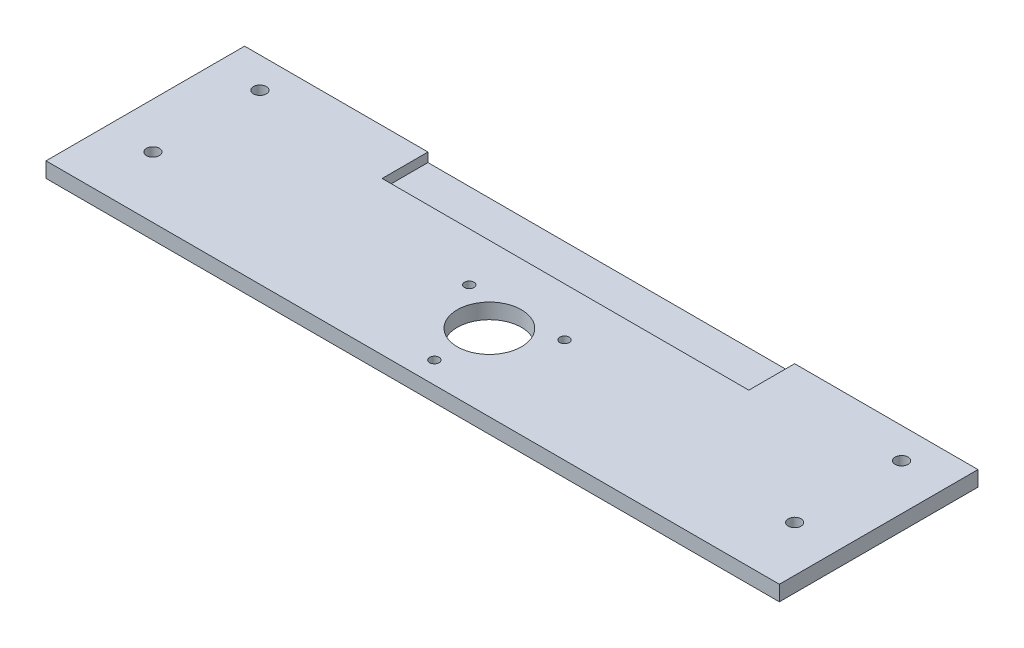
ISO-10303-21;
HEADER;
FILE_DESCRIPTION(('STEP AP214'),'2;1');
FILE_NAME('part.step','',(''),(''),'','','');
FILE_SCHEMA(('AUTOMOTIVE_DESIGN { 1 0 10303 214 1 1 1 1 }'));
ENDSEC;
DATA;
#1=APPLICATION_CONTEXT('core data for automotive mechanical design processes');
#2=APPLICATION_PROTOCOL_DEFINITION('international standard','automotive_design',2000,#1);
#3=PRODUCT_CONTEXT('',#1,'mechanical');
#4=PRODUCT('Part','Part','',(#3));
#5=PRODUCT_RELATED_PRODUCT_CATEGORY('part','',(#4));
#6=PRODUCT_DEFINITION_FORMATION('','',#4);
#7=PRODUCT_DEFINITION_CONTEXT('part definition',#1,'design');
#8=PRODUCT_DEFINITION('design','',#6,#7);
#9=PRODUCT_DEFINITION_SHAPE('','',#8);
#10=(LENGTH_UNIT() NAMED_UNIT(*) SI_UNIT(.MILLI.,.METRE.));
#11=(NAMED_UNIT(*) PLANE_ANGLE_UNIT() SI_UNIT($,.RADIAN.));
#12=(NAMED_UNIT(*) SI_UNIT($,.STERADIAN.) SOLID_ANGLE_UNIT());
#13=UNCERTAINTY_MEASURE_WITH_UNIT(LENGTH_MEASURE(1.E-05),#10,'distance_accuracy_value','');
#14=(GEOMETRIC_REPRESENTATION_CONTEXT(3) GLOBAL_UNCERTAINTY_ASSIGNED_CONTEXT((#13)) GLOBAL_UNIT_ASSIGNED_CONTEXT((#10,
#11,#12)) REPRESENTATION_CONTEXT('',''));
#15=CARTESIAN_POINT('',(0.,0.,0.));
#16=DIRECTION('',(0.,0.,1.));
#17=DIRECTION('',(1.,0.,0.));
#18=AXIS2_PLACEMENT_3D('',#15,#16,#17);
#19=CARTESIAN_POINT('',(0.,5.,7.49999999999996));
#20=DIRECTION('',(0.,0.,-1.));
#21=DIRECTION('',(-1.,0.,0.));
#22=AXIS2_PLACEMENT_3D('',#19,#20,#21);
#23=PLANE('',#22);
#24=DIRECTION('',(1.,0.,0.));
#25=VECTOR('',#24,1.);
#26=CARTESIAN_POINT('',(0.,0.,7.49999999999996));
#27=LINE('',#26,#25);
#28=CARTESIAN_POINT('',(-120.,0.,7.49999999999998));
#29=VERTEX_POINT('',#28);
#30=CARTESIAN_POINT('',(120.,0.,7.49999999999995));
#31=VERTEX_POINT('',#30);
#32=EDGE_CURVE('E168',#29,#31,#27,.T.);
#33=ORIENTED_EDGE('',*,*,#32,.T.);
#34=DIRECTION('',(0.,-1.,0.));
#35=VECTOR('',#34,1.);
#36=CARTESIAN_POINT('',(120.,5.,7.49999999999995));
#37=LINE('',#36,#35);
#38=CARTESIAN_POINT('',(120.,5.,7.49999999999995));
#39=VERTEX_POINT('',#38);
#40=EDGE_CURVE('E11',#39,#31,#37,.T.);
#41=ORIENTED_EDGE('',*,*,#40,.F.);
#42=DIRECTION('',(1.,0.,0.));
#43=VECTOR('',#42,1.);
#44=CARTESIAN_POINT('',(0.,5.,7.49999999999996));
#45=LINE('',#44,#43);
#46=CARTESIAN_POINT('',(-120.,5.,7.49999999999998));
#47=VERTEX_POINT('',#46);
#48=EDGE_CURVE('E148',#47,#39,#45,.T.);
#49=ORIENTED_EDGE('',*,*,#48,.F.);
#50=DIRECTION('',(0.,-1.,0.));
#51=VECTOR('',#50,1.);
#52=CARTESIAN_POINT('',(-120.,5.,7.49999999999998));
#53=LINE('',#52,#51);
#54=EDGE_CURVE('E60',#47,#29,#53,.T.);
#55=ORIENTED_EDGE('',*,*,#54,.T.);
#56=EDGE_LOOP('',(#33,#41,#49,#55));
#57=FACE_BOUND('',#56,.T.);
#58=ADVANCED_FACE('F34',(#57),#23,.F.);
#59=CARTESIAN_POINT('',(120.,5.,0.));
#60=DIRECTION('',(-1.,0.,0.));
#61=DIRECTION('',(0.,0.,1.));
#62=AXIS2_PLACEMENT_3D('',#59,#60,#61);
#63=PLANE('',#62);
#64=DIRECTION('',(0.,0.,-1.));
#65=VECTOR('',#64,1.);
#66=CARTESIAN_POINT('',(120.,0.,0.));
#67=LINE('',#66,#65);
#68=CARTESIAN_POINT('',(120.,0.,-57.4999999999999));
#69=VERTEX_POINT('',#68);
#70=EDGE_CURVE('E170',#31,#69,#67,.T.);
#71=ORIENTED_EDGE('',*,*,#70,.T.);
#72=DIRECTION('',(0.,-1.,0.));
#73=VECTOR('',#72,1.);
#74=CARTESIAN_POINT('',(120.,5.,-57.4999999999999));
#75=LINE('',#74,#73);
#76=CARTESIAN_POINT('',(120.,5.,-57.4999999999999));
#77=VERTEX_POINT('',#76);
#78=EDGE_CURVE('E43',#77,#69,#75,.T.);
#79=ORIENTED_EDGE('',*,*,#78,.F.);
#80=DIRECTION('',(0.,0.,-1.));
#81=VECTOR('',#80,1.);
#82=CARTESIAN_POINT('',(120.,5.,0.));
#83=LINE('',#82,#81);
#84=EDGE_CURVE('E86',#39,#77,#83,.T.);
#85=ORIENTED_EDGE('',*,*,#84,.F.);
#86=ORIENTED_EDGE('',*,*,#40,.T.);
#87=EDGE_LOOP('',(#71,#79,#85,#86));
#88=FACE_BOUND('',#87,.T.);
#89=ADVANCED_FACE('F217',(#88),#63,.F.);
#90=CARTESIAN_POINT('',(0.,5.,-57.5));
#91=DIRECTION('',(0.,0.,-1.));
#92=DIRECTION('',(-1.,0.,0.));
#93=AXIS2_PLACEMENT_3D('',#90,#91,#92);
#94=PLANE('',#93);
#95=DIRECTION('',(0.,1.,0.));
#96=VECTOR('',#95,1.);
#97=CARTESIAN_POINT('',(60.,2.,-57.5));
#98=LINE('',#97,#96);
#99=CARTESIAN_POINT('',(60.,2.,-57.5));
#100=VERTEX_POINT('',#99);
#101=CARTESIAN_POINT('',(60.,5.,-57.5));
#102=VERTEX_POINT('',#101);
#103=EDGE_CURVE('E162',#100,#102,#98,.T.);
#104=ORIENTED_EDGE('',*,*,#103,.T.);
#105=DIRECTION('',(1.,0.,0.));
#106=VECTOR('',#105,1.);
#107=CARTESIAN_POINT('',(0.,5.,-57.5));
#108=LINE('',#107,#106);
#109=EDGE_CURVE('E151',#102,#77,#108,.T.);
#110=ORIENTED_EDGE('',*,*,#109,.T.);
#111=ORIENTED_EDGE('',*,*,#78,.T.);
#112=DIRECTION('',(1.,0.,0.));
#113=VECTOR('',#112,1.);
#114=CARTESIAN_POINT('',(0.,0.,-57.5));
#115=LINE('',#114,#113);
#116=CARTESIAN_POINT('',(-120.,0.,-57.5));
#117=VERTEX_POINT('',#116);
#118=EDGE_CURVE('E173',#117,#69,#115,.T.);
#119=ORIENTED_EDGE('',*,*,#118,.F.);
#120=DIRECTION('',(0.,-1.,0.));
#121=VECTOR('',#120,1.);
#122=CARTESIAN_POINT('',(-120.,5.,-57.5));
#123=LINE('',#122,#121);
#124=CARTESIAN_POINT('',(-120.,5.,-57.5));
#125=VERTEX_POINT('',#124);
#126=EDGE_CURVE('E182',#125,#117,#123,.T.);
#127=ORIENTED_EDGE('',*,*,#126,.F.);
#128=CARTESIAN_POINT('',(-60.,5.,-57.5));
#129=VERTEX_POINT('',#128);
#130=EDGE_CURVE('E131',#125,#129,#108,.T.);
#131=ORIENTED_EDGE('',*,*,#130,.T.);
#132=DIRECTION('',(0.,1.,0.));
#133=VECTOR('',#132,1.);
#134=CARTESIAN_POINT('',(-60.,2.,-57.5));
#135=LINE('',#134,#133);
#136=CARTESIAN_POINT('',(-60.,2.,-57.5));
#137=VERTEX_POINT('',#136);
#138=EDGE_CURVE('E51',#137,#129,#135,.T.);
#139=ORIENTED_EDGE('',*,*,#138,.F.);
#140=DIRECTION('',(-1.,0.,0.));
#141=VECTOR('',#140,1.);
#142=CARTESIAN_POINT('',(-60.,2.,-57.5));
#143=LINE('',#142,#141);
#144=EDGE_CURVE('E117',#100,#137,#143,.T.);
#145=ORIENTED_EDGE('',*,*,#144,.F.);
#146=EDGE_LOOP('',(#104,#110,#111,#119,#127,#131,#139,#145));
#147=FACE_BOUND('',#146,.T.);
#148=ADVANCED_FACE('F129',(#147),#94,.T.);
#149=CARTESIAN_POINT('',(-120.,5.,0.));
#150=DIRECTION('',(-1.,0.,0.));
#151=DIRECTION('',(0.,0.,1.));
#152=AXIS2_PLACEMENT_3D('',#149,#150,#151);
#153=PLANE('',#152);
#154=DIRECTION('',(0.,0.,-1.));
#155=VECTOR('',#154,1.);
#156=CARTESIAN_POINT('',(-120.,0.,0.));
#157=LINE('',#156,#155);
#158=EDGE_CURVE('E176',#29,#117,#157,.T.);
#159=ORIENTED_EDGE('',*,*,#158,.F.);
#160=ORIENTED_EDGE('',*,*,#54,.F.);
#161=DIRECTION('',(0.,0.,-1.));
#162=VECTOR('',#161,1.);
#163=CARTESIAN_POINT('',(-120.,5.,0.));
#164=LINE('',#163,#162);
#165=EDGE_CURVE('E153',#47,#125,#164,.T.);
#166=ORIENTED_EDGE('',*,*,#165,.T.);
#167=ORIENTED_EDGE('',*,*,#126,.T.);
#168=EDGE_LOOP('',(#159,#160,#166,#167));
#169=FACE_BOUND('',#168,.T.);
#170=ADVANCED_FACE('F222',(#169),#153,.T.);
#171=CARTESIAN_POINT('',(-105.,5.,-47.5));
#172=DIRECTION('',(0.,-1.,0.));
#173=DIRECTION('',(0.,0.,-1.));
#174=AXIS2_PLACEMENT_3D('',#171,#172,#173);
#175=CYLINDRICAL_SURFACE('',#174,2.1);
#176=CARTESIAN_POINT('',(-105.,5.,-47.5));
#177=DIRECTION('',(0.,1.,0.));
#178=DIRECTION('',(0.,0.,1.));
#179=AXIS2_PLACEMENT_3D('',#176,#177,#178);
#180=CIRCLE('',#179,2.1);
#181=CARTESIAN_POINT('',(-105.,5.,-45.4));
#182=VERTEX_POINT('',#181);
#183=EDGE_CURVE('E145',#182,#182,#180,.T.);
#184=ORIENTED_EDGE('',*,*,#183,.T.);
#185=EDGE_LOOP('',(#184));
#186=FACE_BOUND('',#185,.T.);
#187=CARTESIAN_POINT('',(-105.,0.,-47.5));
#188=DIRECTION('',(0.,1.,0.));
#189=DIRECTION('',(0.,0.,1.));
#190=AXIS2_PLACEMENT_3D('',#187,#188,#189);
#191=CIRCLE('',#190,2.1);
#192=CARTESIAN_POINT('',(-105.,0.,-45.4));
#193=VERTEX_POINT('',#192);
#194=EDGE_CURVE('E165',#193,#193,#191,.T.);
#195=ORIENTED_EDGE('',*,*,#194,.F.);
#196=EDGE_LOOP('',(#195));
#197=FACE_BOUND('',#196,.T.);
#198=ADVANCED_FACE('F232',(#186,#197),#175,.F.);
#199=CARTESIAN_POINT('',(-105.,5.,-12.5));
#200=DIRECTION('',(0.,-1.,0.));
#201=DIRECTION('',(0.,0.,-1.));
#202=AXIS2_PLACEMENT_3D('',#199,#200,#201);
#203=CYLINDRICAL_SURFACE('',#202,2.1);
#204=CARTESIAN_POINT('',(-105.,5.,-12.5));
#205=DIRECTION('',(0.,1.,0.));
#206=DIRECTION('',(0.,0.,1.));
#207=AXIS2_PLACEMENT_3D('',#204,#205,#206);
#208=CIRCLE('',#207,2.1);
#209=CARTESIAN_POINT('',(-105.,5.,-10.4));
#210=VERTEX_POINT('',#209);
#211=EDGE_CURVE('E141',#210,#210,#208,.T.);
#212=ORIENTED_EDGE('',*,*,#211,.T.);
#213=EDGE_LOOP('',(#212));
#214=FACE_BOUND('',#213,.T.);
#215=CARTESIAN_POINT('',(-105.,0.,-12.5));
#216=DIRECTION('',(0.,1.,0.));
#217=DIRECTION('',(0.,0.,1.));
#218=AXIS2_PLACEMENT_3D('',#215,#216,#217);
#219=CIRCLE('',#218,2.1);
#220=CARTESIAN_POINT('',(-105.,0.,-10.4));
#221=VERTEX_POINT('',#220);
#222=EDGE_CURVE('E161',#221,#221,#219,.T.);
#223=ORIENTED_EDGE('',*,*,#222,.F.);
#224=EDGE_LOOP('',(#223));
#225=FACE_BOUND('',#224,.T.);
#226=ADVANCED_FACE('F234',(#214,#225),#203,.F.);
#227=CARTESIAN_POINT('',(105.,5.,-12.5));
#228=DIRECTION('',(0.,-1.,0.));
#229=DIRECTION('',(0.,0.,-1.));
#230=AXIS2_PLACEMENT_3D('',#227,#228,#229);
#231=CYLINDRICAL_SURFACE('',#230,2.1);
#232=CARTESIAN_POINT('',(105.,5.,-12.5));
#233=DIRECTION('',(0.,1.,0.));
#234=DIRECTION('',(0.,0.,1.));
#235=AXIS2_PLACEMENT_3D('',#232,#233,#234);
#236=CIRCLE('',#235,2.1);
#237=CARTESIAN_POINT('',(105.,5.,-10.4));
#238=VERTEX_POINT('',#237);
#239=EDGE_CURVE('E138',#238,#238,#236,.F.);
#240=ORIENTED_EDGE('',*,*,#239,.F.);
#241=EDGE_LOOP('',(#240));
#242=FACE_BOUND('',#241,.T.);
#243=CARTESIAN_POINT('',(105.,0.,-12.5));
#244=DIRECTION('',(0.,1.,0.));
#245=DIRECTION('',(0.,0.,1.));
#246=AXIS2_PLACEMENT_3D('',#243,#244,#245);
#247=CIRCLE('',#246,2.1);
#248=CARTESIAN_POINT('',(105.,0.,-10.4));
#249=VERTEX_POINT('',#248);
#250=EDGE_CURVE('E158',#249,#249,#247,.F.);
#251=ORIENTED_EDGE('',*,*,#250,.T.);
#252=EDGE_LOOP('',(#251));
#253=FACE_BOUND('',#252,.T.);
#254=ADVANCED_FACE('F36',(#242,#253),#231,.F.);
#255=CARTESIAN_POINT('',(105.,5.,-47.5));
#256=DIRECTION('',(0.,-1.,0.));
#257=DIRECTION('',(0.,0.,-1.));
#258=AXIS2_PLACEMENT_3D('',#255,#256,#257);
#259=CYLINDRICAL_SURFACE('',#258,2.1);
#260=CARTESIAN_POINT('',(105.,5.,-47.5));
#261=DIRECTION('',(0.,1.,0.));
#262=DIRECTION('',(0.,0.,1.));
#263=AXIS2_PLACEMENT_3D('',#260,#261,#262);
#264=CIRCLE('',#263,2.1);
#265=CARTESIAN_POINT('',(105.,5.,-45.4));
#266=VERTEX_POINT('',#265);
#267=EDGE_CURVE('E155',#266,#266,#264,.F.);
#268=ORIENTED_EDGE('',*,*,#267,.F.);
#269=EDGE_LOOP('',(#268));
#270=FACE_BOUND('',#269,.T.);
#271=CARTESIAN_POINT('',(105.,0.,-47.5));
#272=DIRECTION('',(0.,1.,0.));
#273=DIRECTION('',(0.,0.,1.));
#274=AXIS2_PLACEMENT_3D('',#271,#272,#273);
#275=CIRCLE('',#274,2.1);
#276=CARTESIAN_POINT('',(105.,0.,-45.4));
#277=VERTEX_POINT('',#276);
#278=EDGE_CURVE('E142',#277,#277,#275,.F.);
#279=ORIENTED_EDGE('',*,*,#278,.T.);
#280=EDGE_LOOP('',(#279));
#281=FACE_BOUND('',#280,.T.);
#282=ADVANCED_FACE('F241',(#270,#281),#259,.F.);
#283=CARTESIAN_POINT('',(0.,5.,0.));
#284=DIRECTION('',(0.,1.,0.));
#285=DIRECTION('',(0.,0.,1.));
#286=AXIS2_PLACEMENT_3D('',#283,#284,#285);
#287=PLANE('',#286);
#288=CARTESIAN_POINT('',(-15.5884572681197,5.,-26.5934062357272));
#289=DIRECTION('',(0.,1.,0.));
#290=DIRECTION('',(0.,0.,1.));
#291=AXIS2_PLACEMENT_3D('',#288,#289,#290);
#292=CIRCLE('',#291,1.55);
#293=CARTESIAN_POINT('',(-15.5884572681197,5.,-25.0434062357272));
#294=VERTEX_POINT('',#293);
#295=EDGE_CURVE('E395',#294,#294,#292,.T.);
#296=ORIENTED_EDGE('',*,*,#295,.F.);
#297=EDGE_LOOP('',(#296));
#298=FACE_BOUND('',#297,.T.);
#299=CARTESIAN_POINT('',(0.,5.,0.406593764272944));
#300=DIRECTION('',(0.,1.,0.));
#301=DIRECTION('',(0.,0.,1.));
#302=AXIS2_PLACEMENT_3D('',#299,#300,#301);
#303=CIRCLE('',#302,1.55);
#304=CARTESIAN_POINT('',(0.,5.,1.95659376427294));
#305=VERTEX_POINT('',#304);
#306=EDGE_CURVE('E396',#305,#305,#303,.T.);
#307=ORIENTED_EDGE('',*,*,#306,.F.);
#308=EDGE_LOOP('',(#307));
#309=FACE_BOUND('',#308,.T.);
#310=CARTESIAN_POINT('',(15.5884572681201,5.,-26.5934062357268));
#311=DIRECTION('',(0.,1.,0.));
#312=DIRECTION('',(0.,0.,1.));
#313=AXIS2_PLACEMENT_3D('',#310,#311,#312);
#314=CIRCLE('',#313,1.55);
#315=CARTESIAN_POINT('',(15.5884572681201,5.,-25.0434062357268));
#316=VERTEX_POINT('',#315);
#317=EDGE_CURVE('E399',#316,#316,#314,.T.);
#318=ORIENTED_EDGE('',*,*,#317,.F.);
#319=EDGE_LOOP('',(#318));
#320=FACE_BOUND('',#319,.T.);
#321=CARTESIAN_POINT('',(0.,5.,-17.5934062357271));
#322=DIRECTION('',(0.,1.,0.));
#323=DIRECTION('',(0.,0.,1.));
#324=AXIS2_PLACEMENT_3D('',#321,#322,#323);
#325=CIRCLE('',#324,10.5);
#326=CARTESIAN_POINT('',(0.,5.,-7.09340623572705));
#327=VERTEX_POINT('',#326);
#328=EDGE_CURVE('E189',#327,#327,#325,.T.);
#329=ORIENTED_EDGE('',*,*,#328,.F.);
#330=EDGE_LOOP('',(#329));
#331=FACE_BOUND('',#330,.T.);
#332=DIRECTION('',(0.,0.,-1.));
#333=VECTOR('',#332,1.);
#334=CARTESIAN_POINT('',(60.,5.,-57.5));
#335=LINE('',#334,#333);
#336=CARTESIAN_POINT('',(60.,5.,-42.5));
#337=VERTEX_POINT('',#336);
#338=EDGE_CURVE('E126',#337,#102,#335,.T.);
#339=ORIENTED_EDGE('',*,*,#338,.F.);
#340=DIRECTION('',(1.,0.,0.));
#341=VECTOR('',#340,1.);
#342=CARTESIAN_POINT('',(-60.,5.,-42.5));
#343=LINE('',#342,#341);
#344=CARTESIAN_POINT('',(-60.,5.,-42.5));
#345=VERTEX_POINT('',#344);
#346=EDGE_CURVE('E199',#345,#337,#343,.T.);
#347=ORIENTED_EDGE('',*,*,#346,.F.);
#348=DIRECTION('',(0.,0.,1.));
#349=VECTOR('',#348,1.);
#350=CARTESIAN_POINT('',(-60.,5.,-57.5));
#351=LINE('',#350,#349);
#352=EDGE_CURVE('E196',#129,#345,#351,.T.);
#353=ORIENTED_EDGE('',*,*,#352,.F.);
#354=ORIENTED_EDGE('',*,*,#130,.F.);
#355=ORIENTED_EDGE('',*,*,#165,.F.);
#356=ORIENTED_EDGE('',*,*,#48,.T.);
#357=ORIENTED_EDGE('',*,*,#84,.T.);
#358=ORIENTED_EDGE('',*,*,#109,.F.);
#359=EDGE_LOOP('',(#339,#347,#353,#354,#355,#356,#357,#358));
#360=FACE_BOUND('',#359,.T.);
#361=ORIENTED_EDGE('',*,*,#239,.T.);
#362=EDGE_LOOP('',(#361));
#363=FACE_BOUND('',#362,.T.);
#364=ORIENTED_EDGE('',*,*,#211,.F.);
#365=EDGE_LOOP('',(#364));
#366=FACE_BOUND('',#365,.T.);
#367=ORIENTED_EDGE('',*,*,#183,.F.);
#368=EDGE_LOOP('',(#367));
#369=FACE_BOUND('',#368,.T.);
#370=ORIENTED_EDGE('',*,*,#267,.T.);
#371=EDGE_LOOP('',(#370));
#372=FACE_BOUND('',#371,.T.);
#373=ADVANCED_FACE('F214',(#298,#309,#320,#331,#360,#363,#366,#369,#372),#287,.T.);
#374=CARTESIAN_POINT('',(0.,0.,0.));
#375=DIRECTION('',(0.,1.,0.));
#376=DIRECTION('',(0.,0.,1.));
#377=AXIS2_PLACEMENT_3D('',#374,#375,#376);
#378=PLANE('',#377);
#379=CARTESIAN_POINT('',(-15.5884572681197,0.,-26.5934062357272));
#380=DIRECTION('',(0.,1.,0.));
#381=DIRECTION('',(0.,0.,1.));
#382=AXIS2_PLACEMENT_3D('',#379,#380,#381);
#383=CIRCLE('',#382,1.55);
#384=CARTESIAN_POINT('',(-15.5884572681197,0.,-25.0434062357272));
#385=VERTEX_POINT('',#384);
#386=EDGE_CURVE('E38',#385,#385,#383,.T.);
#387=ORIENTED_EDGE('',*,*,#386,.T.);
#388=EDGE_LOOP('',(#387));
#389=FACE_BOUND('',#388,.T.);
#390=CARTESIAN_POINT('',(0.,0.,0.406593764272944));
#391=DIRECTION('',(0.,1.,0.));
#392=DIRECTION('',(0.,0.,1.));
#393=AXIS2_PLACEMENT_3D('',#390,#391,#392);
#394=CIRCLE('',#393,1.55);
#395=CARTESIAN_POINT('',(0.,0.,1.95659376427294));
#396=VERTEX_POINT('',#395);
#397=EDGE_CURVE('E191',#396,#396,#394,.T.);
#398=ORIENTED_EDGE('',*,*,#397,.T.);
#399=EDGE_LOOP('',(#398));
#400=FACE_BOUND('',#399,.T.);
#401=CARTESIAN_POINT('',(15.5884572681201,0.,-26.5934062357268));
#402=DIRECTION('',(0.,1.,0.));
#403=DIRECTION('',(0.,0.,1.));
#404=AXIS2_PLACEMENT_3D('',#401,#402,#403);
#405=CIRCLE('',#404,1.55);
#406=CARTESIAN_POINT('',(15.5884572681201,0.,-25.0434062357268));
#407=VERTEX_POINT('',#406);
#408=EDGE_CURVE('E188',#407,#407,#405,.T.);
#409=ORIENTED_EDGE('',*,*,#408,.T.);
#410=EDGE_LOOP('',(#409));
#411=FACE_BOUND('',#410,.T.);
#412=CARTESIAN_POINT('',(0.,0.,-17.5934062357271));
#413=DIRECTION('',(0.,1.,0.));
#414=DIRECTION('',(0.,0.,1.));
#415=AXIS2_PLACEMENT_3D('',#412,#413,#414);
#416=CIRCLE('',#415,10.5);
#417=CARTESIAN_POINT('',(0.,0.,-7.09340623572705));
#418=VERTEX_POINT('',#417);
#419=EDGE_CURVE('E185',#418,#418,#416,.T.);
#420=ORIENTED_EDGE('',*,*,#419,.T.);
#421=EDGE_LOOP('',(#420));
#422=FACE_BOUND('',#421,.T.);
#423=ORIENTED_EDGE('',*,*,#250,.F.);
#424=EDGE_LOOP('',(#423));
#425=FACE_BOUND('',#424,.T.);
#426=ORIENTED_EDGE('',*,*,#222,.T.);
#427=EDGE_LOOP('',(#426));
#428=FACE_BOUND('',#427,.T.);
#429=ORIENTED_EDGE('',*,*,#194,.T.);
#430=EDGE_LOOP('',(#429));
#431=FACE_BOUND('',#430,.T.);
#432=ORIENTED_EDGE('',*,*,#32,.F.);
#433=ORIENTED_EDGE('',*,*,#158,.T.);
#434=ORIENTED_EDGE('',*,*,#118,.T.);
#435=ORIENTED_EDGE('',*,*,#70,.F.);
#436=EDGE_LOOP('',(#432,#433,#434,#435));
#437=FACE_BOUND('',#436,.T.);
#438=ORIENTED_EDGE('',*,*,#278,.F.);
#439=EDGE_LOOP('',(#438));
#440=FACE_BOUND('',#439,.T.);
#441=ADVANCED_FACE('F220',(#389,#400,#411,#422,#425,#428,#431,#437,#440),#378,.F.);
#442=CARTESIAN_POINT('',(60.,2.,-57.5));
#443=DIRECTION('',(1.,0.,0.));
#444=DIRECTION('',(0.,0.,-1.));
#445=AXIS2_PLACEMENT_3D('',#442,#443,#444);
#446=PLANE('',#445);
#447=ORIENTED_EDGE('',*,*,#338,.T.);
#448=ORIENTED_EDGE('',*,*,#103,.F.);
#449=DIRECTION('',(0.,0.,-1.));
#450=VECTOR('',#449,1.);
#451=CARTESIAN_POINT('',(60.,2.,-57.5));
#452=LINE('',#451,#450);
#453=CARTESIAN_POINT('',(60.,2.,-42.5));
#454=VERTEX_POINT('',#453);
#455=EDGE_CURVE('E123',#454,#100,#452,.T.);
#456=ORIENTED_EDGE('',*,*,#455,.F.);
#457=DIRECTION('',(0.,1.,0.));
#458=VECTOR('',#457,1.);
#459=CARTESIAN_POINT('',(60.,2.,-42.5));
#460=LINE('',#459,#458);
#461=EDGE_CURVE('E133',#454,#337,#460,.T.);
#462=ORIENTED_EDGE('',*,*,#461,.T.);
#463=EDGE_LOOP('',(#447,#448,#456,#462));
#464=FACE_BOUND('',#463,.T.);
#465=ADVANCED_FACE('F208',(#464),#446,.F.);
#466=CARTESIAN_POINT('',(-60.,2.,-42.5));
#467=DIRECTION('',(0.,0.,1.));
#468=DIRECTION('',(1.,0.,0.));
#469=AXIS2_PLACEMENT_3D('',#466,#467,#468);
#470=PLANE('',#469);
#471=ORIENTED_EDGE('',*,*,#346,.T.);
#472=ORIENTED_EDGE('',*,*,#461,.F.);
#473=DIRECTION('',(1.,0.,0.));
#474=VECTOR('',#473,1.);
#475=CARTESIAN_POINT('',(-60.,2.,-42.5));
#476=LINE('',#475,#474);
#477=CARTESIAN_POINT('',(-60.,2.,-42.5));
#478=VERTEX_POINT('',#477);
#479=EDGE_CURVE('E116',#478,#454,#476,.T.);
#480=ORIENTED_EDGE('',*,*,#479,.F.);
#481=DIRECTION('',(0.,1.,0.));
#482=VECTOR('',#481,1.);
#483=CARTESIAN_POINT('',(-60.,2.,-42.5));
#484=LINE('',#483,#482);
#485=EDGE_CURVE('E112',#478,#345,#484,.T.);
#486=ORIENTED_EDGE('',*,*,#485,.T.);
#487=EDGE_LOOP('',(#471,#472,#480,#486));
#488=FACE_BOUND('',#487,.T.);
#489=ADVANCED_FACE('F211',(#488),#470,.F.);
#490=CARTESIAN_POINT('',(-60.,2.,-57.5));
#491=DIRECTION('',(-1.,0.,0.));
#492=DIRECTION('',(0.,0.,1.));
#493=AXIS2_PLACEMENT_3D('',#490,#491,#492);
#494=PLANE('',#493);
#495=ORIENTED_EDGE('',*,*,#352,.T.);
#496=ORIENTED_EDGE('',*,*,#485,.F.);
#497=DIRECTION('',(0.,0.,1.));
#498=VECTOR('',#497,1.);
#499=CARTESIAN_POINT('',(-60.,2.,-57.5));
#500=LINE('',#499,#498);
#501=EDGE_CURVE('E109',#137,#478,#500,.T.);
#502=ORIENTED_EDGE('',*,*,#501,.F.);
#503=ORIENTED_EDGE('',*,*,#138,.T.);
#504=EDGE_LOOP('',(#495,#496,#502,#503));
#505=FACE_BOUND('',#504,.T.);
#506=ADVANCED_FACE('F111',(#505),#494,.F.);
#507=CARTESIAN_POINT('',(0.,2.,0.));
#508=DIRECTION('',(0.,-1.,0.));
#509=DIRECTION('',(0.,0.,-1.));
#510=AXIS2_PLACEMENT_3D('',#507,#508,#509);
#511=PLANE('',#510);
#512=ORIENTED_EDGE('',*,*,#144,.T.);
#513=ORIENTED_EDGE('',*,*,#501,.T.);
#514=ORIENTED_EDGE('',*,*,#479,.T.);
#515=ORIENTED_EDGE('',*,*,#455,.T.);
#516=EDGE_LOOP('',(#512,#513,#514,#515));
#517=FACE_BOUND('',#516,.T.);
#518=ADVANCED_FACE('F121',(#517),#511,.F.);
#519=CARTESIAN_POINT('',(0.,-27.,-17.5934062357271));
#520=DIRECTION('',(0.,1.,0.));
#521=DIRECTION('',(0.,0.,1.));
#522=AXIS2_PLACEMENT_3D('',#519,#520,#521);
#523=CYLINDRICAL_SURFACE('',#522,10.5);
#524=ORIENTED_EDGE('',*,*,#328,.T.);
#525=EDGE_LOOP('',(#524));
#526=FACE_BOUND('',#525,.T.);
#527=ORIENTED_EDGE('',*,*,#419,.F.);
#528=EDGE_LOOP('',(#527));
#529=FACE_BOUND('',#528,.T.);
#530=ADVANCED_FACE('F301',(#526,#529),#523,.F.);
#531=CARTESIAN_POINT('',(15.5884572681201,-27.,-26.5934062357268));
#532=DIRECTION('',(0.,1.,0.));
#533=DIRECTION('',(0.,0.,1.));
#534=AXIS2_PLACEMENT_3D('',#531,#532,#533);
#535=CYLINDRICAL_SURFACE('',#534,1.55);
#536=ORIENTED_EDGE('',*,*,#317,.T.);
#537=EDGE_LOOP('',(#536));
#538=FACE_BOUND('',#537,.T.);
#539=ORIENTED_EDGE('',*,*,#408,.F.);
#540=EDGE_LOOP('',(#539));
#541=FACE_BOUND('',#540,.T.);
#542=ADVANCED_FACE('F358',(#538,#541),#535,.F.);
#543=CARTESIAN_POINT('',(0.,-27.,0.406593764272944));
#544=DIRECTION('',(0.,1.,0.));
#545=DIRECTION('',(0.,0.,1.));
#546=AXIS2_PLACEMENT_3D('',#543,#544,#545);
#547=CYLINDRICAL_SURFACE('',#546,1.55);
#548=ORIENTED_EDGE('',*,*,#306,.T.);
#549=EDGE_LOOP('',(#548));
#550=FACE_BOUND('',#549,.T.);
#551=ORIENTED_EDGE('',*,*,#397,.F.);
#552=EDGE_LOOP('',(#551));
#553=FACE_BOUND('',#552,.T.);
#554=ADVANCED_FACE('F365',(#550,#553),#547,.F.);
#555=CARTESIAN_POINT('',(-15.5884572681197,-27.,-26.5934062357272));
#556=DIRECTION('',(0.,1.,0.));
#557=DIRECTION('',(0.,0.,1.));
#558=AXIS2_PLACEMENT_3D('',#555,#556,#557);
#559=CYLINDRICAL_SURFACE('',#558,1.55);
#560=ORIENTED_EDGE('',*,*,#295,.T.);
#561=EDGE_LOOP('',(#560));
#562=FACE_BOUND('',#561,.T.);
#563=ORIENTED_EDGE('',*,*,#386,.F.);
#564=EDGE_LOOP('',(#563));
#565=FACE_BOUND('',#564,.T.);
#566=ADVANCED_FACE('F373',(#562,#565),#559,.F.);
#567=CLOSED_SHELL('',(#58,#89,#148,#170,#198,#226,#254,#282,#373,#441,#465,#489,#506,#518,#530,
#542,#554,#566));
#568=MANIFOLD_SOLID_BREP('B2',#567);
#569=ADVANCED_BREP_SHAPE_REPRESENTATION('',(#18,#568),#14);
#570=SHAPE_DEFINITION_REPRESENTATION(#9,#569);
ENDSEC;
END-ISO-10303-21;
